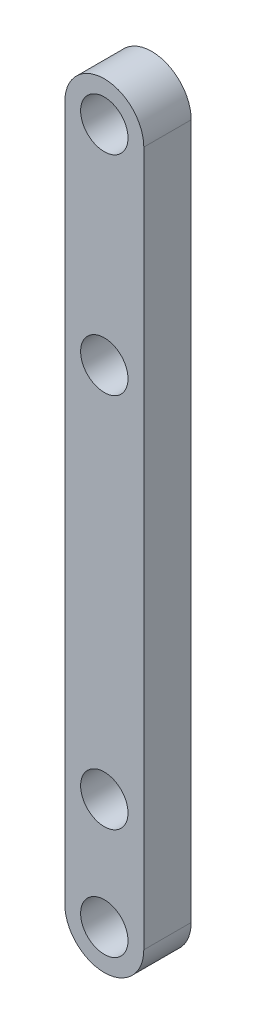
ISO-10303-21;
HEADER;
FILE_DESCRIPTION(('STEP AP214'),'2;1');
FILE_NAME('part.step','',(''),(''),'','','');
FILE_SCHEMA(('AUTOMOTIVE_DESIGN { 1 0 10303 214 1 1 1 1 }'));
ENDSEC;
DATA;
#1=APPLICATION_CONTEXT('core data for automotive mechanical design processes');
#2=APPLICATION_PROTOCOL_DEFINITION('international standard','automotive_design',2000,#1);
#3=PRODUCT_CONTEXT('',#1,'mechanical');
#4=PRODUCT('Part','Part','',(#3));
#5=PRODUCT_RELATED_PRODUCT_CATEGORY('part','',(#4));
#6=PRODUCT_DEFINITION_FORMATION('','',#4);
#7=PRODUCT_DEFINITION_CONTEXT('part definition',#1,'design');
#8=PRODUCT_DEFINITION('design','',#6,#7);
#9=PRODUCT_DEFINITION_SHAPE('','',#8);
#10=(LENGTH_UNIT() NAMED_UNIT(*) SI_UNIT(.MILLI.,.METRE.));
#11=(NAMED_UNIT(*) PLANE_ANGLE_UNIT() SI_UNIT($,.RADIAN.));
#12=(NAMED_UNIT(*) SI_UNIT($,.STERADIAN.) SOLID_ANGLE_UNIT());
#13=UNCERTAINTY_MEASURE_WITH_UNIT(LENGTH_MEASURE(1.E-05),#10,'distance_accuracy_value','');
#14=(GEOMETRIC_REPRESENTATION_CONTEXT(3) GLOBAL_UNCERTAINTY_ASSIGNED_CONTEXT((#13)) GLOBAL_UNIT_ASSIGNED_CONTEXT((#10,
#11,#12)) REPRESENTATION_CONTEXT('',''));
#15=CARTESIAN_POINT('',(0.,0.,0.));
#16=DIRECTION('',(0.,0.,1.));
#17=DIRECTION('',(1.,0.,0.));
#18=AXIS2_PLACEMENT_3D('',#15,#16,#17);
#19=CARTESIAN_POINT('',(0.,0.,30.));
#20=DIRECTION('',(0.,0.,1.));
#21=DIRECTION('',(1.,0.,0.));
#22=AXIS2_PLACEMENT_3D('',#19,#20,#21);
#23=PLANE('',#22);
#24=CARTESIAN_POINT('',(0.,70.,30.));
#25=DIRECTION('',(0.,0.,1.));
#26=DIRECTION('',(1.,0.,0.));
#27=AXIS2_PLACEMENT_3D('',#24,#25,#26);
#28=CIRCLE('',#27,15.);
#29=CARTESIAN_POINT('',(15.,70.,30.));
#30=VERTEX_POINT('',#29);
#31=EDGE_CURVE('E125',#30,#30,#28,.T.);
#32=ORIENTED_EDGE('',*,*,#31,.F.);
#33=EDGE_LOOP('',(#32));
#34=FACE_BOUND('',#33,.T.);
#35=CARTESIAN_POINT('',(0.,440.,30.));
#36=DIRECTION('',(0.,0.,1.));
#37=DIRECTION('',(1.,0.,0.));
#38=AXIS2_PLACEMENT_3D('',#35,#36,#37);
#39=CIRCLE('',#38,15.);
#40=CARTESIAN_POINT('',(15.,440.,30.));
#41=VERTEX_POINT('',#40);
#42=EDGE_CURVE('E104',#41,#41,#39,.T.);
#43=ORIENTED_EDGE('',*,*,#42,.F.);
#44=EDGE_LOOP('',(#43));
#45=FACE_BOUND('',#44,.T.);
#46=CARTESIAN_POINT('',(0.,0.,30.));
#47=DIRECTION('',(0.,0.,1.));
#48=DIRECTION('',(1.,0.,0.));
#49=AXIS2_PLACEMENT_3D('',#46,#47,#48);
#50=CIRCLE('',#49,25.);
#51=CARTESIAN_POINT('',(-25.,0.,30.));
#52=VERTEX_POINT('',#51);
#53=CARTESIAN_POINT('',(25.,0.,30.));
#54=VERTEX_POINT('',#53);
#55=EDGE_CURVE('E89',#52,#54,#50,.T.);
#56=ORIENTED_EDGE('',*,*,#55,.T.);
#57=DIRECTION('',(0.,1.,0.));
#58=VECTOR('',#57,1.);
#59=CARTESIAN_POINT('',(25.,0.,30.));
#60=LINE('',#59,#58);
#61=CARTESIAN_POINT('',(25.,440.,30.));
#62=VERTEX_POINT('',#61);
#63=EDGE_CURVE('E84',#54,#62,#60,.T.);
#64=ORIENTED_EDGE('',*,*,#63,.T.);
#65=CARTESIAN_POINT('',(0.,440.,30.));
#66=DIRECTION('',(0.,0.,1.));
#67=DIRECTION('',(1.,0.,0.));
#68=AXIS2_PLACEMENT_3D('',#65,#66,#67);
#69=CIRCLE('',#68,25.);
#70=CARTESIAN_POINT('',(-25.,440.,30.));
#71=VERTEX_POINT('',#70);
#72=EDGE_CURVE('E87',#62,#71,#69,.T.);
#73=ORIENTED_EDGE('',*,*,#72,.T.);
#74=DIRECTION('',(0.,-1.,0.));
#75=VECTOR('',#74,1.);
#76=CARTESIAN_POINT('',(-25.,0.,30.));
#77=LINE('',#76,#75);
#78=EDGE_CURVE('E54',#71,#52,#77,.T.);
#79=ORIENTED_EDGE('',*,*,#78,.T.);
#80=EDGE_LOOP('',(#56,#64,#73,#79));
#81=FACE_BOUND('',#80,.T.);
#82=CARTESIAN_POINT('',(0.,308.,30.));
#83=DIRECTION('',(0.,0.,1.));
#84=DIRECTION('',(1.,0.,0.));
#85=AXIS2_PLACEMENT_3D('',#82,#83,#84);
#86=CIRCLE('',#85,15.);
#87=CARTESIAN_POINT('',(15.,308.,30.));
#88=VERTEX_POINT('',#87);
#89=EDGE_CURVE('E119',#88,#88,#86,.T.);
#90=ORIENTED_EDGE('',*,*,#89,.F.);
#91=EDGE_LOOP('',(#90));
#92=FACE_BOUND('',#91,.T.);
#93=CARTESIAN_POINT('',(0.,0.,30.));
#94=DIRECTION('',(0.,0.,1.));
#95=DIRECTION('',(1.,0.,0.));
#96=AXIS2_PLACEMENT_3D('',#93,#94,#95);
#97=CIRCLE('',#96,15.);
#98=CARTESIAN_POINT('',(15.,0.,30.));
#99=VERTEX_POINT('',#98);
#100=EDGE_CURVE('E131',#99,#99,#97,.T.);
#101=ORIENTED_EDGE('',*,*,#100,.F.);
#102=EDGE_LOOP('',(#101));
#103=FACE_BOUND('',#102,.T.);
#104=ADVANCED_FACE('F37',(#34,#45,#81,#92,#103),#23,.T.);
#105=CARTESIAN_POINT('',(0.,0.,0.));
#106=DIRECTION('',(0.,0.,1.));
#107=DIRECTION('',(1.,0.,0.));
#108=AXIS2_PLACEMENT_3D('',#105,#106,#107);
#109=PLANE('',#108);
#110=CARTESIAN_POINT('',(0.,0.,0.));
#111=DIRECTION('',(0.,0.,1.));
#112=DIRECTION('',(1.,0.,0.));
#113=AXIS2_PLACEMENT_3D('',#110,#111,#112);
#114=CIRCLE('',#113,25.);
#115=CARTESIAN_POINT('',(-25.,0.,0.));
#116=VERTEX_POINT('',#115);
#117=CARTESIAN_POINT('',(25.,0.,0.));
#118=VERTEX_POINT('',#117);
#119=EDGE_CURVE('E101',#116,#118,#114,.T.);
#120=ORIENTED_EDGE('',*,*,#119,.F.);
#121=DIRECTION('',(0.,-1.,0.));
#122=VECTOR('',#121,1.);
#123=CARTESIAN_POINT('',(-25.,0.,0.));
#124=LINE('',#123,#122);
#125=CARTESIAN_POINT('',(-25.,440.,0.));
#126=VERTEX_POINT('',#125);
#127=EDGE_CURVE('E77',#126,#116,#124,.T.);
#128=ORIENTED_EDGE('',*,*,#127,.F.);
#129=CARTESIAN_POINT('',(0.,440.,0.));
#130=DIRECTION('',(0.,0.,1.));
#131=DIRECTION('',(1.,0.,0.));
#132=AXIS2_PLACEMENT_3D('',#129,#130,#131);
#133=CIRCLE('',#132,25.);
#134=CARTESIAN_POINT('',(25.,440.,0.));
#135=VERTEX_POINT('',#134);
#136=EDGE_CURVE('E71',#135,#126,#133,.T.);
#137=ORIENTED_EDGE('',*,*,#136,.F.);
#138=DIRECTION('',(0.,1.,0.));
#139=VECTOR('',#138,1.);
#140=CARTESIAN_POINT('',(25.,0.,0.));
#141=LINE('',#140,#139);
#142=EDGE_CURVE('E93',#118,#135,#141,.T.);
#143=ORIENTED_EDGE('',*,*,#142,.F.);
#144=EDGE_LOOP('',(#120,#128,#137,#143));
#145=FACE_BOUND('',#144,.T.);
#146=CARTESIAN_POINT('',(0.,440.,0.));
#147=DIRECTION('',(0.,0.,1.));
#148=DIRECTION('',(1.,0.,0.));
#149=AXIS2_PLACEMENT_3D('',#146,#147,#148);
#150=CIRCLE('',#149,15.);
#151=CARTESIAN_POINT('',(15.,440.,0.));
#152=VERTEX_POINT('',#151);
#153=EDGE_CURVE('E116',#152,#152,#150,.T.);
#154=ORIENTED_EDGE('',*,*,#153,.T.);
#155=EDGE_LOOP('',(#154));
#156=FACE_BOUND('',#155,.T.);
#157=CARTESIAN_POINT('',(0.,308.,0.));
#158=DIRECTION('',(0.,0.,1.));
#159=DIRECTION('',(1.,0.,0.));
#160=AXIS2_PLACEMENT_3D('',#157,#158,#159);
#161=CIRCLE('',#160,15.);
#162=CARTESIAN_POINT('',(15.,308.,0.));
#163=VERTEX_POINT('',#162);
#164=EDGE_CURVE('E122',#163,#163,#161,.T.);
#165=ORIENTED_EDGE('',*,*,#164,.T.);
#166=EDGE_LOOP('',(#165));
#167=FACE_BOUND('',#166,.T.);
#168=CARTESIAN_POINT('',(0.,70.,0.));
#169=DIRECTION('',(0.,0.,1.));
#170=DIRECTION('',(1.,0.,0.));
#171=AXIS2_PLACEMENT_3D('',#168,#169,#170);
#172=CIRCLE('',#171,15.);
#173=CARTESIAN_POINT('',(15.,70.,0.));
#174=VERTEX_POINT('',#173);
#175=EDGE_CURVE('E128',#174,#174,#172,.T.);
#176=ORIENTED_EDGE('',*,*,#175,.T.);
#177=EDGE_LOOP('',(#176));
#178=FACE_BOUND('',#177,.T.);
#179=CARTESIAN_POINT('',(0.,0.,0.));
#180=DIRECTION('',(0.,0.,1.));
#181=DIRECTION('',(1.,0.,0.));
#182=AXIS2_PLACEMENT_3D('',#179,#180,#181);
#183=CIRCLE('',#182,15.);
#184=CARTESIAN_POINT('',(15.,0.,0.));
#185=VERTEX_POINT('',#184);
#186=EDGE_CURVE('E134',#185,#185,#183,.T.);
#187=ORIENTED_EDGE('',*,*,#186,.T.);
#188=EDGE_LOOP('',(#187));
#189=FACE_BOUND('',#188,.T.);
#190=ADVANCED_FACE('F112',(#145,#156,#167,#178,#189),#109,.F.);
#191=CARTESIAN_POINT('',(0.,0.,30.));
#192=DIRECTION('',(0.,0.,-1.));
#193=DIRECTION('',(-1.,0.,0.));
#194=AXIS2_PLACEMENT_3D('',#191,#192,#193);
#195=CYLINDRICAL_SURFACE('',#194,25.);
#196=ORIENTED_EDGE('',*,*,#119,.T.);
#197=DIRECTION('',(0.,0.,-1.));
#198=VECTOR('',#197,1.);
#199=CARTESIAN_POINT('',(25.,0.,30.));
#200=LINE('',#199,#198);
#201=EDGE_CURVE('E11',#54,#118,#200,.T.);
#202=ORIENTED_EDGE('',*,*,#201,.F.);
#203=ORIENTED_EDGE('',*,*,#55,.F.);
#204=DIRECTION('',(0.,0.,-1.));
#205=VECTOR('',#204,1.);
#206=CARTESIAN_POINT('',(-25.,0.,30.));
#207=LINE('',#206,#205);
#208=EDGE_CURVE('E97',#52,#116,#207,.T.);
#209=ORIENTED_EDGE('',*,*,#208,.T.);
#210=EDGE_LOOP('',(#196,#202,#203,#209));
#211=FACE_BOUND('',#210,.T.);
#212=ADVANCED_FACE('F39',(#211),#195,.T.);
#213=CARTESIAN_POINT('',(25.,0.,30.));
#214=DIRECTION('',(-1.,0.,0.));
#215=DIRECTION('',(0.,0.,1.));
#216=AXIS2_PLACEMENT_3D('',#213,#214,#215);
#217=PLANE('',#216);
#218=ORIENTED_EDGE('',*,*,#142,.T.);
#219=DIRECTION('',(0.,0.,-1.));
#220=VECTOR('',#219,1.);
#221=CARTESIAN_POINT('',(25.,440.,30.));
#222=LINE('',#221,#220);
#223=EDGE_CURVE('E46',#62,#135,#222,.T.);
#224=ORIENTED_EDGE('',*,*,#223,.F.);
#225=ORIENTED_EDGE('',*,*,#63,.F.);
#226=ORIENTED_EDGE('',*,*,#201,.T.);
#227=EDGE_LOOP('',(#218,#224,#225,#226));
#228=FACE_BOUND('',#227,.T.);
#229=ADVANCED_FACE('F92',(#228),#217,.F.);
#230=CARTESIAN_POINT('',(0.,440.,30.));
#231=DIRECTION('',(0.,0.,-1.));
#232=DIRECTION('',(-1.,0.,0.));
#233=AXIS2_PLACEMENT_3D('',#230,#231,#232);
#234=CYLINDRICAL_SURFACE('',#233,25.);
#235=ORIENTED_EDGE('',*,*,#136,.T.);
#236=DIRECTION('',(0.,0.,-1.));
#237=VECTOR('',#236,1.);
#238=CARTESIAN_POINT('',(-25.,440.,30.));
#239=LINE('',#238,#237);
#240=EDGE_CURVE('E94',#71,#126,#239,.T.);
#241=ORIENTED_EDGE('',*,*,#240,.F.);
#242=ORIENTED_EDGE('',*,*,#72,.F.);
#243=ORIENTED_EDGE('',*,*,#223,.T.);
#244=EDGE_LOOP('',(#235,#241,#242,#243));
#245=FACE_BOUND('',#244,.T.);
#246=ADVANCED_FACE('F95',(#245),#234,.T.);
#247=CARTESIAN_POINT('',(-25.,0.,30.));
#248=DIRECTION('',(1.,0.,0.));
#249=DIRECTION('',(0.,0.,-1.));
#250=AXIS2_PLACEMENT_3D('',#247,#248,#249);
#251=PLANE('',#250);
#252=ORIENTED_EDGE('',*,*,#127,.T.);
#253=ORIENTED_EDGE('',*,*,#208,.F.);
#254=ORIENTED_EDGE('',*,*,#78,.F.);
#255=ORIENTED_EDGE('',*,*,#240,.T.);
#256=EDGE_LOOP('',(#252,#253,#254,#255));
#257=FACE_BOUND('',#256,.T.);
#258=ADVANCED_FACE('F109',(#257),#251,.F.);
#259=CARTESIAN_POINT('',(0.,440.,30.));
#260=DIRECTION('',(0.,0.,-1.));
#261=DIRECTION('',(-1.,0.,0.));
#262=AXIS2_PLACEMENT_3D('',#259,#260,#261);
#263=CYLINDRICAL_SURFACE('',#262,15.);
#264=ORIENTED_EDGE('',*,*,#42,.T.);
#265=EDGE_LOOP('',(#264));
#266=FACE_BOUND('',#265,.T.);
#267=ORIENTED_EDGE('',*,*,#153,.F.);
#268=EDGE_LOOP('',(#267));
#269=FACE_BOUND('',#268,.T.);
#270=ADVANCED_FACE('F153',(#266,#269),#263,.F.);
#271=CARTESIAN_POINT('',(0.,308.,30.));
#272=DIRECTION('',(0.,0.,-1.));
#273=DIRECTION('',(-1.,0.,0.));
#274=AXIS2_PLACEMENT_3D('',#271,#272,#273);
#275=CYLINDRICAL_SURFACE('',#274,15.);
#276=ORIENTED_EDGE('',*,*,#89,.T.);
#277=EDGE_LOOP('',(#276));
#278=FACE_BOUND('',#277,.T.);
#279=ORIENTED_EDGE('',*,*,#164,.F.);
#280=EDGE_LOOP('',(#279));
#281=FACE_BOUND('',#280,.T.);
#282=ADVANCED_FACE('F207',(#278,#281),#275,.F.);
#283=CARTESIAN_POINT('',(0.,70.,30.));
#284=DIRECTION('',(0.,0.,-1.));
#285=DIRECTION('',(-1.,0.,0.));
#286=AXIS2_PLACEMENT_3D('',#283,#284,#285);
#287=CYLINDRICAL_SURFACE('',#286,15.);
#288=ORIENTED_EDGE('',*,*,#31,.T.);
#289=EDGE_LOOP('',(#288));
#290=FACE_BOUND('',#289,.T.);
#291=ORIENTED_EDGE('',*,*,#175,.F.);
#292=EDGE_LOOP('',(#291));
#293=FACE_BOUND('',#292,.T.);
#294=ADVANCED_FACE('F216',(#290,#293),#287,.F.);
#295=CARTESIAN_POINT('',(0.,0.,30.));
#296=DIRECTION('',(0.,0.,-1.));
#297=DIRECTION('',(-1.,0.,0.));
#298=AXIS2_PLACEMENT_3D('',#295,#296,#297);
#299=CYLINDRICAL_SURFACE('',#298,15.);
#300=ORIENTED_EDGE('',*,*,#100,.T.);
#301=EDGE_LOOP('',(#300));
#302=FACE_BOUND('',#301,.T.);
#303=ORIENTED_EDGE('',*,*,#186,.F.);
#304=EDGE_LOOP('',(#303));
#305=FACE_BOUND('',#304,.T.);
#306=ADVANCED_FACE('F140',(#302,#305),#299,.F.);
#307=CLOSED_SHELL('',(#104,#190,#212,#229,#246,#258,#270,#282,#294,#306));
#308=MANIFOLD_SOLID_BREP('B2',#307);
#309=ADVANCED_BREP_SHAPE_REPRESENTATION('',(#18,#308),#14);
#310=SHAPE_DEFINITION_REPRESENTATION(#9,#309);
ENDSEC;
END-ISO-10303-21;
